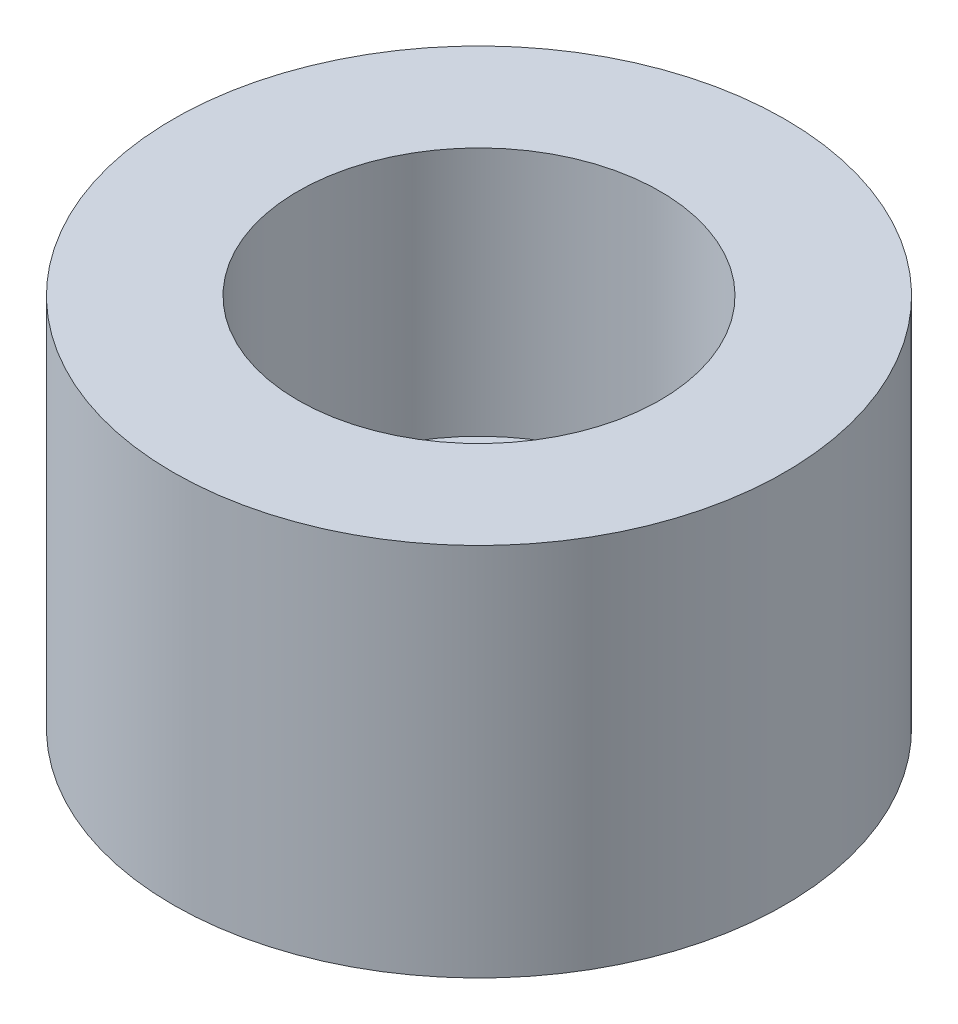
ISO-10303-21;
HEADER;
FILE_DESCRIPTION(('STEP AP214'),'2;1');
FILE_NAME('part.step','',(''),(''),'','','');
FILE_SCHEMA(('AUTOMOTIVE_DESIGN { 1 0 10303 214 1 1 1 1 }'));
ENDSEC;
DATA;
#1=APPLICATION_CONTEXT('core data for automotive mechanical design processes');
#2=APPLICATION_PROTOCOL_DEFINITION('international standard','automotive_design',2000,#1);
#3=PRODUCT_CONTEXT('',#1,'mechanical');
#4=PRODUCT('Part','Part','',(#3));
#5=PRODUCT_RELATED_PRODUCT_CATEGORY('part','',(#4));
#6=PRODUCT_DEFINITION_FORMATION('','',#4);
#7=PRODUCT_DEFINITION_CONTEXT('part definition',#1,'design');
#8=PRODUCT_DEFINITION('design','',#6,#7);
#9=PRODUCT_DEFINITION_SHAPE('','',#8);
#10=(LENGTH_UNIT() NAMED_UNIT(*) SI_UNIT(.MILLI.,.METRE.));
#11=(NAMED_UNIT(*) PLANE_ANGLE_UNIT() SI_UNIT($,.RADIAN.));
#12=(NAMED_UNIT(*) SI_UNIT($,.STERADIAN.) SOLID_ANGLE_UNIT());
#13=UNCERTAINTY_MEASURE_WITH_UNIT(LENGTH_MEASURE(1.E-05),#10,'distance_accuracy_value','');
#14=(GEOMETRIC_REPRESENTATION_CONTEXT(3) GLOBAL_UNCERTAINTY_ASSIGNED_CONTEXT((#13)) GLOBAL_UNIT_ASSIGNED_CONTEXT((#10,
#11,#12)) REPRESENTATION_CONTEXT('',''));
#15=CARTESIAN_POINT('',(0.,0.,0.));
#16=DIRECTION('',(0.,0.,1.));
#17=DIRECTION('',(1.,0.,0.));
#18=AXIS2_PLACEMENT_3D('',#15,#16,#17);
#19=CARTESIAN_POINT('',(0.,4.,0.));
#20=DIRECTION('',(0.,1.,0.));
#21=DIRECTION('',(0.,0.,1.));
#22=AXIS2_PLACEMENT_3D('',#19,#20,#21);
#23=PLANE('',#22);
#24=CARTESIAN_POINT('',(0.,4.,0.));
#25=DIRECTION('',(0.,1.,0.));
#26=DIRECTION('',(0.,0.,1.));
#27=AXIS2_PLACEMENT_3D('',#24,#25,#26);
#28=CIRCLE('',#27,4.9);
#29=CARTESIAN_POINT('',(0.,4.,4.9));
#30=VERTEX_POINT('',#29);
#31=EDGE_CURVE('E10',#30,#30,#28,.T.);
#32=ORIENTED_EDGE('',*,*,#31,.T.);
#33=EDGE_LOOP('',(#32));
#34=FACE_BOUND('',#33,.T.);
#35=CARTESIAN_POINT('',(0.,4.,0.));
#36=DIRECTION('',(0.,1.,0.));
#37=DIRECTION('',(0.,0.,1.));
#38=AXIS2_PLACEMENT_3D('',#35,#36,#37);
#39=CIRCLE('',#38,2.9);
#40=CARTESIAN_POINT('',(0.,4.,2.9));
#41=VERTEX_POINT('',#40);
#42=EDGE_CURVE('E51',#41,#41,#39,.T.);
#43=ORIENTED_EDGE('',*,*,#42,.F.);
#44=EDGE_LOOP('',(#43));
#45=FACE_BOUND('',#44,.T.);
#46=ADVANCED_FACE('F43',(#34,#45),#23,.T.);
#47=CARTESIAN_POINT('',(0.,4.,0.));
#48=DIRECTION('',(0.,-1.,0.));
#49=DIRECTION('',(0.,0.,-1.));
#50=AXIS2_PLACEMENT_3D('',#47,#48,#49);
#51=CYLINDRICAL_SURFACE('',#50,4.9);
#52=ORIENTED_EDGE('',*,*,#31,.F.);
#53=EDGE_LOOP('',(#52));
#54=FACE_BOUND('',#53,.T.);
#55=CARTESIAN_POINT('',(0.,-2.,0.));
#56=DIRECTION('',(0.,1.,0.));
#57=DIRECTION('',(0.,0.,1.));
#58=AXIS2_PLACEMENT_3D('',#55,#56,#57);
#59=CIRCLE('',#58,4.9);
#60=CARTESIAN_POINT('',(0.,-2.,4.9));
#61=VERTEX_POINT('',#60);
#62=EDGE_CURVE('E62',#61,#61,#59,.T.);
#63=ORIENTED_EDGE('',*,*,#62,.T.);
#64=EDGE_LOOP('',(#63));
#65=FACE_BOUND('',#64,.T.);
#66=ADVANCED_FACE('F45',(#54,#65),#51,.T.);
#67=CARTESIAN_POINT('',(0.,4.,0.));
#68=DIRECTION('',(0.,-1.,0.));
#69=DIRECTION('',(0.,0.,-1.));
#70=AXIS2_PLACEMENT_3D('',#67,#68,#69);
#71=CYLINDRICAL_SURFACE('',#70,2.9);
#72=ORIENTED_EDGE('',*,*,#42,.T.);
#73=EDGE_LOOP('',(#72));
#74=FACE_BOUND('',#73,.T.);
#75=CARTESIAN_POINT('',(0.,0.,0.));
#76=DIRECTION('',(0.,1.,0.));
#77=DIRECTION('',(0.,0.,1.));
#78=AXIS2_PLACEMENT_3D('',#75,#76,#77);
#79=CIRCLE('',#78,2.9);
#80=CARTESIAN_POINT('',(0.,0.,2.9));
#81=VERTEX_POINT('',#80);
#82=EDGE_CURVE('E56',#81,#81,#79,.T.);
#83=ORIENTED_EDGE('',*,*,#82,.F.);
#84=EDGE_LOOP('',(#83));
#85=FACE_BOUND('',#84,.T.);
#86=ADVANCED_FACE('F76',(#74,#85),#71,.F.);
#87=CARTESIAN_POINT('',(0.,0.,0.));
#88=DIRECTION('',(0.,1.,0.));
#89=DIRECTION('',(0.,0.,1.));
#90=AXIS2_PLACEMENT_3D('',#87,#88,#89);
#91=PLANE('',#90);
#92=ORIENTED_EDGE('',*,*,#82,.T.);
#93=EDGE_LOOP('',(#92));
#94=FACE_BOUND('',#93,.T.);
#95=ADVANCED_FACE('F71',(#94),#91,.T.);
#96=CARTESIAN_POINT('',(0.,-2.,0.));
#97=DIRECTION('',(0.,1.,0.));
#98=DIRECTION('',(0.,0.,1.));
#99=AXIS2_PLACEMENT_3D('',#96,#97,#98);
#100=PLANE('',#99);
#101=ORIENTED_EDGE('',*,*,#62,.F.);
#102=EDGE_LOOP('',(#101));
#103=FACE_BOUND('',#102,.T.);
#104=ADVANCED_FACE('F69',(#103),#100,.F.);
#105=CLOSED_SHELL('',(#46,#66,#86,#95,#104));
#106=MANIFOLD_SOLID_BREP('B2',#105);
#107=ADVANCED_BREP_SHAPE_REPRESENTATION('',(#18,#106),#14);
#108=SHAPE_DEFINITION_REPRESENTATION(#9,#107);
ENDSEC;
END-ISO-10303-21;
